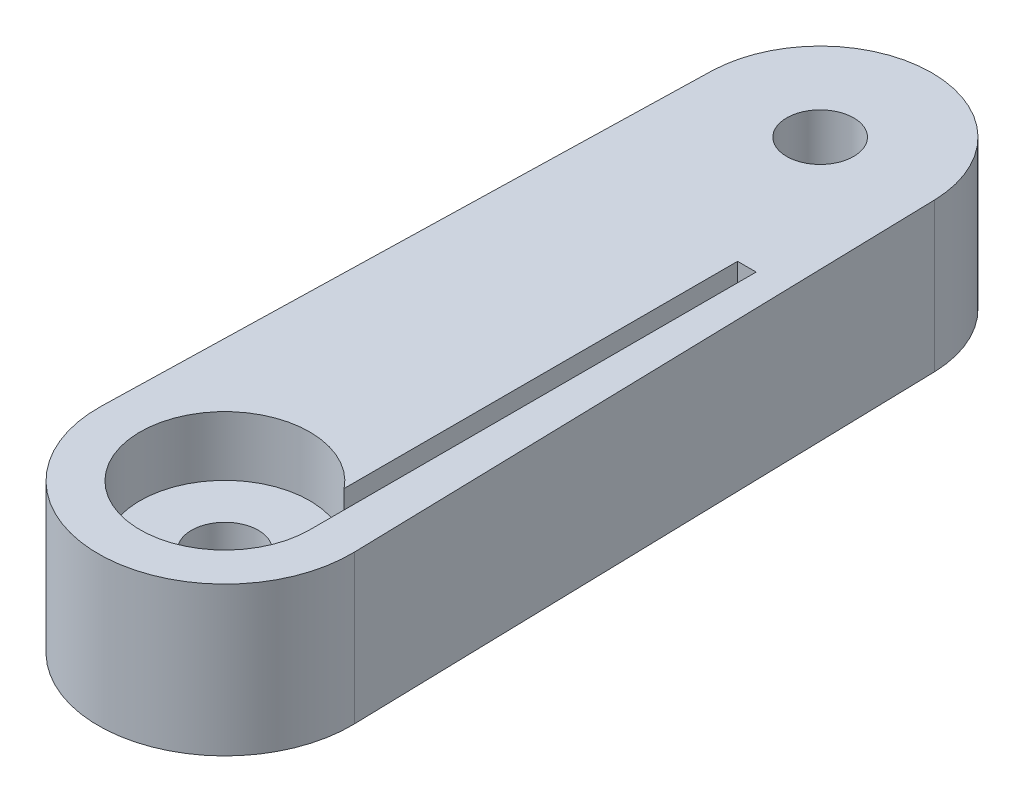
ISO-10303-21;
HEADER;
FILE_DESCRIPTION(('STEP AP214'),'2;1');
FILE_NAME('part.step','',(''),(''),'','','');
FILE_SCHEMA(('AUTOMOTIVE_DESIGN { 1 0 10303 214 1 1 1 1 }'));
ENDSEC;
DATA;
#1=APPLICATION_CONTEXT('core data for automotive mechanical design processes');
#2=APPLICATION_PROTOCOL_DEFINITION('international standard','automotive_design',2000,#1);
#3=PRODUCT_CONTEXT('',#1,'mechanical');
#4=PRODUCT('Part','Part','',(#3));
#5=PRODUCT_RELATED_PRODUCT_CATEGORY('part','',(#4));
#6=PRODUCT_DEFINITION_FORMATION('','',#4);
#7=PRODUCT_DEFINITION_CONTEXT('part definition',#1,'design');
#8=PRODUCT_DEFINITION('design','',#6,#7);
#9=PRODUCT_DEFINITION_SHAPE('','',#8);
#10=(LENGTH_UNIT() NAMED_UNIT(*) SI_UNIT(.MILLI.,.METRE.));
#11=(NAMED_UNIT(*) PLANE_ANGLE_UNIT() SI_UNIT($,.RADIAN.));
#12=(NAMED_UNIT(*) SI_UNIT($,.STERADIAN.) SOLID_ANGLE_UNIT());
#13=UNCERTAINTY_MEASURE_WITH_UNIT(LENGTH_MEASURE(1.E-05),#10,'distance_accuracy_value','');
#14=(GEOMETRIC_REPRESENTATION_CONTEXT(3) GLOBAL_UNCERTAINTY_ASSIGNED_CONTEXT((#13)) GLOBAL_UNIT_ASSIGNED_CONTEXT((#10,
#11,#12)) REPRESENTATION_CONTEXT('',''));
#15=CARTESIAN_POINT('',(0.,0.,0.));
#16=DIRECTION('',(0.,0.,1.));
#17=DIRECTION('',(1.,0.,0.));
#18=AXIS2_PLACEMENT_3D('',#15,#16,#17);
#19=CARTESIAN_POINT('',(0.,0.,0.));
#20=DIRECTION('',(0.,1.,0.));
#21=DIRECTION('',(0.,0.,1.));
#22=AXIS2_PLACEMENT_3D('',#19,#20,#21);
#23=PLANE('',#22);
#24=DIRECTION('',(0.025,0.,-0.99968745115661));
#25=VECTOR('',#24,1.);
#26=CARTESIAN_POINT('',(-4.24867166741559,0.,-0.10625));
#27=LINE('',#26,#25);
#28=CARTESIAN_POINT('',(-4.24867166741559,0.,-0.10625));
#29=VERTEX_POINT('',#28);
#30=CARTESIAN_POINT('',(-3.74882794183729,0.,-20.09375));
#31=VERTEX_POINT('',#30);
#32=EDGE_CURVE('E282',#29,#31,#27,.T.);
#33=ORIENTED_EDGE('',*,*,#32,.T.);
#34=CARTESIAN_POINT('',(0.,0.,-20.));
#35=DIRECTION('',(0.,1.,0.));
#36=DIRECTION('',(0.,0.,1.));
#37=AXIS2_PLACEMENT_3D('',#34,#35,#36);
#38=CIRCLE('',#37,3.75);
#39=CARTESIAN_POINT('',(3.74882794183729,0.,-20.09375));
#40=VERTEX_POINT('',#39);
#41=EDGE_CURVE('E293',#40,#31,#38,.T.);
#42=ORIENTED_EDGE('',*,*,#41,.F.);
#43=DIRECTION('',(-0.025,0.,-0.99968745115661));
#44=VECTOR('',#43,1.);
#45=CARTESIAN_POINT('',(4.24867166741559,0.,-0.10625));
#46=LINE('',#45,#44);
#47=CARTESIAN_POINT('',(4.24867166741559,0.,-0.10625));
#48=VERTEX_POINT('',#47);
#49=EDGE_CURVE('E307',#48,#40,#46,.T.);
#50=ORIENTED_EDGE('',*,*,#49,.F.);
#51=CARTESIAN_POINT('',(0.,0.,0.));
#52=DIRECTION('',(0.,1.,0.));
#53=DIRECTION('',(0.,0.,1.));
#54=AXIS2_PLACEMENT_3D('',#51,#52,#53);
#55=CIRCLE('',#54,4.25);
#56=EDGE_CURVE('E305',#29,#48,#55,.T.);
#57=ORIENTED_EDGE('',*,*,#56,.F.);
#58=EDGE_LOOP('',(#33,#42,#50,#57));
#59=FACE_BOUND('',#58,.T.);
#60=DIRECTION('',(-0.866025403784439,0.,0.5));
#61=VECTOR('',#60,1.);
#62=CARTESIAN_POINT('',(1.0625,0.,1.84030398304193));
#63=LINE('',#62,#61);
#64=CARTESIAN_POINT('',(2.125,0.,1.22686932202796));
#65=VERTEX_POINT('',#64);
#66=CARTESIAN_POINT('',(0.,0.,2.45373864405591));
#67=VERTEX_POINT('',#66);
#68=EDGE_CURVE('E230',#65,#67,#63,.T.);
#69=ORIENTED_EDGE('',*,*,#68,.F.);
#70=DIRECTION('',(0.,0.,1.));
#71=VECTOR('',#70,1.);
#72=CARTESIAN_POINT('',(2.125,0.,0.));
#73=LINE('',#72,#71);
#74=CARTESIAN_POINT('',(2.125,0.,-1.22686932202796));
#75=VERTEX_POINT('',#74);
#76=EDGE_CURVE('E65',#75,#65,#73,.T.);
#77=ORIENTED_EDGE('',*,*,#76,.F.);
#78=DIRECTION('',(0.866025403784439,0.,0.5));
#79=VECTOR('',#78,1.);
#80=CARTESIAN_POINT('',(1.0625,0.,-1.84030398304193));
#81=LINE('',#80,#79);
#82=CARTESIAN_POINT('',(0.,0.,-2.45373864405591));
#83=VERTEX_POINT('',#82);
#84=EDGE_CURVE('E210',#83,#75,#81,.T.);
#85=ORIENTED_EDGE('',*,*,#84,.F.);
#86=DIRECTION('',(0.866025403784439,0.,-0.5));
#87=VECTOR('',#86,1.);
#88=CARTESIAN_POINT('',(-1.0625,0.,-1.84030398304193));
#89=LINE('',#88,#87);
#90=CARTESIAN_POINT('',(-2.125,0.,-1.22686932202796));
#91=VERTEX_POINT('',#90);
#92=EDGE_CURVE('E239',#91,#83,#89,.T.);
#93=ORIENTED_EDGE('',*,*,#92,.F.);
#94=DIRECTION('',(0.,0.,-1.));
#95=VECTOR('',#94,1.);
#96=CARTESIAN_POINT('',(-2.125,0.,0.));
#97=LINE('',#96,#95);
#98=CARTESIAN_POINT('',(-2.125,0.,1.22686932202796));
#99=VERTEX_POINT('',#98);
#100=EDGE_CURVE('E236',#99,#91,#97,.T.);
#101=ORIENTED_EDGE('',*,*,#100,.F.);
#102=DIRECTION('',(-0.866025403784439,0.,-0.5));
#103=VECTOR('',#102,1.);
#104=CARTESIAN_POINT('',(-1.0625,0.,1.84030398304193));
#105=LINE('',#104,#103);
#106=EDGE_CURVE('E233',#67,#99,#105,.T.);
#107=ORIENTED_EDGE('',*,*,#106,.F.);
#108=EDGE_LOOP('',(#69,#77,#85,#93,#101,#107));
#109=FACE_BOUND('',#108,.T.);
#110=DIRECTION('',(0.,0.,1.));
#111=VECTOR('',#110,1.);
#112=CARTESIAN_POINT('',(-2.125,0.,-21.226869322028));
#113=LINE('',#112,#111);
#114=CARTESIAN_POINT('',(-2.125,0.,-21.226869322028));
#115=VERTEX_POINT('',#114);
#116=CARTESIAN_POINT('',(-2.125,0.,-18.773130677972));
#117=VERTEX_POINT('',#116);
#118=EDGE_CURVE('E57',#115,#117,#113,.T.);
#119=ORIENTED_EDGE('',*,*,#118,.T.);
#120=DIRECTION('',(0.866025403784439,0.,0.5));
#121=VECTOR('',#120,1.);
#122=CARTESIAN_POINT('',(-2.125,0.,-18.773130677972));
#123=LINE('',#122,#121);
#124=CARTESIAN_POINT('',(0.,0.,-17.5462613559441));
#125=VERTEX_POINT('',#124);
#126=EDGE_CURVE('E198',#117,#125,#123,.T.);
#127=ORIENTED_EDGE('',*,*,#126,.T.);
#128=DIRECTION('',(0.866025403784439,0.,-0.5));
#129=VECTOR('',#128,1.);
#130=CARTESIAN_POINT('',(0.,0.,-17.5462613559441));
#131=LINE('',#130,#129);
#132=CARTESIAN_POINT('',(2.125,0.,-18.773130677972));
#133=VERTEX_POINT('',#132);
#134=EDGE_CURVE('E629',#125,#133,#131,.T.);
#135=ORIENTED_EDGE('',*,*,#134,.T.);
#136=DIRECTION('',(0.,0.,-1.));
#137=VECTOR('',#136,1.);
#138=CARTESIAN_POINT('',(2.125,0.,-18.773130677972));
#139=LINE('',#138,#137);
#140=CARTESIAN_POINT('',(2.125,0.,-21.226869322028));
#141=VERTEX_POINT('',#140);
#142=EDGE_CURVE('E626',#133,#141,#139,.T.);
#143=ORIENTED_EDGE('',*,*,#142,.T.);
#144=DIRECTION('',(-0.866025403784438,0.,-0.500000000000001));
#145=VECTOR('',#144,1.);
#146=CARTESIAN_POINT('',(2.125,0.,-21.226869322028));
#147=LINE('',#146,#145);
#148=CARTESIAN_POINT('',(0.,0.,-22.4537386440559));
#149=VERTEX_POINT('',#148);
#150=EDGE_CURVE('E620',#141,#149,#147,.T.);
#151=ORIENTED_EDGE('',*,*,#150,.T.);
#152=DIRECTION('',(-0.866025403784439,0.,0.5));
#153=VECTOR('',#152,1.);
#154=CARTESIAN_POINT('',(0.,0.,-22.4537386440559));
#155=LINE('',#154,#153);
#156=EDGE_CURVE('E194',#149,#115,#155,.T.);
#157=ORIENTED_EDGE('',*,*,#156,.T.);
#158=EDGE_LOOP('',(#119,#127,#135,#143,#151,#157));
#159=FACE_BOUND('',#158,.T.);
#160=ADVANCED_FACE('F41',(#59,#109,#159),#23,.F.);
#161=CARTESIAN_POINT('',(0.,5.,0.));
#162=DIRECTION('',(0.,-1.,0.));
#163=DIRECTION('',(0.,0.,-1.));
#164=AXIS2_PLACEMENT_3D('',#161,#162,#163);
#165=CYLINDRICAL_SURFACE('',#164,1.125);
#166=CARTESIAN_POINT('',(0.,3.,0.));
#167=DIRECTION('',(0.,1.,0.));
#168=DIRECTION('',(0.,0.,1.));
#169=AXIS2_PLACEMENT_3D('',#166,#167,#168);
#170=CIRCLE('',#169,1.125);
#171=CARTESIAN_POINT('',(0.,3.,1.125));
#172=VERTEX_POINT('',#171);
#173=EDGE_CURVE('E267',#172,#172,#170,.F.);
#174=ORIENTED_EDGE('',*,*,#173,.F.);
#175=EDGE_LOOP('',(#174));
#176=FACE_BOUND('',#175,.T.);
#177=CARTESIAN_POINT('',(0.,1.5,0.));
#178=DIRECTION('',(0.,-1.,0.));
#179=DIRECTION('',(0.,0.,-1.));
#180=AXIS2_PLACEMENT_3D('',#177,#178,#179);
#181=CIRCLE('',#180,1.125);
#182=CARTESIAN_POINT('',(0.,1.5,-1.125));
#183=VERTEX_POINT('',#182);
#184=EDGE_CURVE('E206',#183,#183,#181,.F.);
#185=ORIENTED_EDGE('',*,*,#184,.F.);
#186=EDGE_LOOP('',(#185));
#187=FACE_BOUND('',#186,.T.);
#188=ADVANCED_FACE('F340',(#176,#187),#165,.F.);
#189=CARTESIAN_POINT('',(-4.24867166741559,5.,-0.10625));
#190=DIRECTION('',(-0.99968745115661,0.,-0.025));
#191=DIRECTION('',(-0.025,0.,0.99968745115661));
#192=AXIS2_PLACEMENT_3D('',#189,#190,#191);
#193=PLANE('',#192);
#194=ORIENTED_EDGE('',*,*,#32,.F.);
#195=DIRECTION('',(0.,-1.,0.));
#196=VECTOR('',#195,1.);
#197=CARTESIAN_POINT('',(-4.24867166741559,5.,-0.10625));
#198=LINE('',#197,#196);
#199=CARTESIAN_POINT('',(-4.24867166741559,5.,-0.10625));
#200=VERTEX_POINT('',#199);
#201=EDGE_CURVE('E11',#200,#29,#198,.T.);
#202=ORIENTED_EDGE('',*,*,#201,.F.);
#203=DIRECTION('',(0.025,0.,-0.99968745115661));
#204=VECTOR('',#203,1.);
#205=CARTESIAN_POINT('',(-4.24867166741559,5.,-0.10625));
#206=LINE('',#205,#204);
#207=CARTESIAN_POINT('',(-3.74882794183729,5.,-20.09375));
#208=VERTEX_POINT('',#207);
#209=EDGE_CURVE('E289',#200,#208,#206,.T.);
#210=ORIENTED_EDGE('',*,*,#209,.T.);
#211=DIRECTION('',(0.,-1.,0.));
#212=VECTOR('',#211,1.);
#213=CARTESIAN_POINT('',(-3.74882794183729,5.,-20.09375));
#214=LINE('',#213,#212);
#215=EDGE_CURVE('E302',#208,#31,#214,.T.);
#216=ORIENTED_EDGE('',*,*,#215,.T.);
#217=EDGE_LOOP('',(#194,#202,#210,#216));
#218=FACE_BOUND('',#217,.T.);
#219=ADVANCED_FACE('F43',(#218),#193,.T.);
#220=CARTESIAN_POINT('',(0.,5.,0.));
#221=DIRECTION('',(0.,-1.,0.));
#222=DIRECTION('',(0.,0.,-1.));
#223=AXIS2_PLACEMENT_3D('',#220,#221,#222);
#224=CYLINDRICAL_SURFACE('',#223,4.25);
#225=ORIENTED_EDGE('',*,*,#56,.T.);
#226=DIRECTION('',(0.,-1.,0.));
#227=VECTOR('',#226,1.);
#228=CARTESIAN_POINT('',(4.24867166741559,5.,-0.10625));
#229=LINE('',#228,#227);
#230=CARTESIAN_POINT('',(4.24867166741559,5.,-0.10625));
#231=VERTEX_POINT('',#230);
#232=EDGE_CURVE('E50',#231,#48,#229,.T.);
#233=ORIENTED_EDGE('',*,*,#232,.F.);
#234=CARTESIAN_POINT('',(0.,5.,0.));
#235=DIRECTION('',(0.,1.,0.));
#236=DIRECTION('',(0.,0.,1.));
#237=AXIS2_PLACEMENT_3D('',#234,#235,#236);
#238=CIRCLE('',#237,4.25);
#239=EDGE_CURVE('E292',#200,#231,#238,.T.);
#240=ORIENTED_EDGE('',*,*,#239,.F.);
#241=ORIENTED_EDGE('',*,*,#201,.T.);
#242=EDGE_LOOP('',(#225,#233,#240,#241));
#243=FACE_BOUND('',#242,.T.);
#244=ADVANCED_FACE('F337',(#243),#224,.T.);
#245=CARTESIAN_POINT('',(4.24867166741559,5.,-0.10625));
#246=DIRECTION('',(-0.99968745115661,0.,0.025));
#247=DIRECTION('',(0.025,0.,0.99968745115661));
#248=AXIS2_PLACEMENT_3D('',#245,#246,#247);
#249=PLANE('',#248);
#250=ORIENTED_EDGE('',*,*,#49,.T.);
#251=DIRECTION('',(0.,-1.,0.));
#252=VECTOR('',#251,1.);
#253=CARTESIAN_POINT('',(3.74882794183729,5.,-20.09375));
#254=LINE('',#253,#252);
#255=CARTESIAN_POINT('',(3.74882794183729,5.,-20.09375));
#256=VERTEX_POINT('',#255);
#257=EDGE_CURVE('E312',#256,#40,#254,.T.);
#258=ORIENTED_EDGE('',*,*,#257,.F.);
#259=DIRECTION('',(-0.025,0.,-0.99968745115661));
#260=VECTOR('',#259,1.);
#261=CARTESIAN_POINT('',(4.24867166741559,5.,-0.10625));
#262=LINE('',#261,#260);
#263=EDGE_CURVE('E295',#231,#256,#262,.T.);
#264=ORIENTED_EDGE('',*,*,#263,.F.);
#265=ORIENTED_EDGE('',*,*,#232,.T.);
#266=EDGE_LOOP('',(#250,#258,#264,#265));
#267=FACE_BOUND('',#266,.T.);
#268=ADVANCED_FACE('F320',(#267),#249,.F.);
#269=CARTESIAN_POINT('',(0.,5.,-20.));
#270=DIRECTION('',(0.,-1.,0.));
#271=DIRECTION('',(0.,0.,-1.));
#272=AXIS2_PLACEMENT_3D('',#269,#270,#271);
#273=CYLINDRICAL_SURFACE('',#272,1.125);
#274=CARTESIAN_POINT('',(0.,2.,-20.));
#275=DIRECTION('',(0.,1.,0.));
#276=DIRECTION('',(0.,0.,1.));
#277=AXIS2_PLACEMENT_3D('',#274,#275,#276);
#278=CIRCLE('',#277,1.125);
#279=CARTESIAN_POINT('',(0.,2.,-18.875));
#280=VERTEX_POINT('',#279);
#281=EDGE_CURVE('E45',#280,#280,#278,.T.);
#282=ORIENTED_EDGE('',*,*,#281,.F.);
#283=EDGE_LOOP('',(#282));
#284=FACE_BOUND('',#283,.T.);
#285=CARTESIAN_POINT('',(0.,5.,-20.));
#286=DIRECTION('',(0.,1.,0.));
#287=DIRECTION('',(0.,0.,1.));
#288=AXIS2_PLACEMENT_3D('',#285,#286,#287);
#289=CIRCLE('',#288,1.125);
#290=CARTESIAN_POINT('',(0.,5.,-18.875));
#291=VERTEX_POINT('',#290);
#292=EDGE_CURVE('E299',#291,#291,#289,.T.);
#293=ORIENTED_EDGE('',*,*,#292,.T.);
#294=EDGE_LOOP('',(#293));
#295=FACE_BOUND('',#294,.T.);
#296=ADVANCED_FACE('F354',(#284,#295),#273,.F.);
#297=CARTESIAN_POINT('',(0.,5.,-20.));
#298=DIRECTION('',(0.,-1.,0.));
#299=DIRECTION('',(0.,0.,-1.));
#300=AXIS2_PLACEMENT_3D('',#297,#298,#299);
#301=CYLINDRICAL_SURFACE('',#300,3.75);
#302=ORIENTED_EDGE('',*,*,#41,.T.);
#303=ORIENTED_EDGE('',*,*,#215,.F.);
#304=CARTESIAN_POINT('',(0.,5.,-20.));
#305=DIRECTION('',(0.,1.,0.));
#306=DIRECTION('',(0.,0.,1.));
#307=AXIS2_PLACEMENT_3D('',#304,#305,#306);
#308=CIRCLE('',#307,3.75);
#309=EDGE_CURVE('E297',#256,#208,#308,.T.);
#310=ORIENTED_EDGE('',*,*,#309,.F.);
#311=ORIENTED_EDGE('',*,*,#257,.T.);
#312=EDGE_LOOP('',(#302,#303,#310,#311));
#313=FACE_BOUND('',#312,.T.);
#314=ADVANCED_FACE('F331',(#313),#301,.T.);
#315=CARTESIAN_POINT('',(0.,5.,0.));
#316=DIRECTION('',(0.,1.,0.));
#317=DIRECTION('',(0.,0.,1.));
#318=AXIS2_PLACEMENT_3D('',#315,#316,#317);
#319=PLANE('',#318);
#320=CARTESIAN_POINT('',(0.,5.,0.));
#321=DIRECTION('',(0.,1.,0.));
#322=DIRECTION('',(0.,0.,1.));
#323=AXIS2_PLACEMENT_3D('',#320,#321,#322);
#324=CIRCLE('',#323,2.85);
#325=CARTESIAN_POINT('',(2.225,5.,-1.78097585609688));
#326=VERTEX_POINT('',#325);
#327=CARTESIAN_POINT('',(2.85,5.,0.));
#328=VERTEX_POINT('',#327);
#329=EDGE_CURVE('E246',#326,#328,#324,.T.);
#330=ORIENTED_EDGE('',*,*,#329,.F.);
#331=DIRECTION('',(0.,0.,-1.));
#332=VECTOR('',#331,1.);
#333=CARTESIAN_POINT('',(2.225,5.,0.));
#334=LINE('',#333,#332);
#335=CARTESIAN_POINT('',(2.225,5.,-15.));
#336=VERTEX_POINT('',#335);
#337=EDGE_CURVE('E260',#326,#336,#334,.T.);
#338=ORIENTED_EDGE('',*,*,#337,.T.);
#339=DIRECTION('',(1.,0.,0.));
#340=VECTOR('',#339,1.);
#341=CARTESIAN_POINT('',(0.,5.,-15.));
#342=LINE('',#341,#340);
#343=CARTESIAN_POINT('',(2.85,5.,-15.));
#344=VERTEX_POINT('',#343);
#345=EDGE_CURVE('E275',#336,#344,#342,.T.);
#346=ORIENTED_EDGE('',*,*,#345,.T.);
#347=DIRECTION('',(0.,0.,-1.));
#348=VECTOR('',#347,1.);
#349=CARTESIAN_POINT('',(2.85,5.,0.));
#350=LINE('',#349,#348);
#351=EDGE_CURVE('E272',#328,#344,#350,.T.);
#352=ORIENTED_EDGE('',*,*,#351,.F.);
#353=EDGE_LOOP('',(#330,#338,#346,#352));
#354=FACE_BOUND('',#353,.T.);
#355=ORIENTED_EDGE('',*,*,#209,.F.);
#356=ORIENTED_EDGE('',*,*,#239,.T.);
#357=ORIENTED_EDGE('',*,*,#263,.T.);
#358=ORIENTED_EDGE('',*,*,#309,.T.);
#359=EDGE_LOOP('',(#355,#356,#357,#358));
#360=FACE_BOUND('',#359,.T.);
#361=ORIENTED_EDGE('',*,*,#292,.F.);
#362=EDGE_LOOP('',(#361));
#363=FACE_BOUND('',#362,.T.);
#364=ADVANCED_FACE('F335',(#354,#360,#363),#319,.T.);
#365=CARTESIAN_POINT('',(0.,3.,0.));
#366=DIRECTION('',(0.,1.,0.));
#367=DIRECTION('',(0.,0.,1.));
#368=AXIS2_PLACEMENT_3D('',#365,#366,#367);
#369=CYLINDRICAL_SURFACE('',#368,2.85);
#370=ORIENTED_EDGE('',*,*,#329,.T.);
#371=DIRECTION('',(0.,1.,0.));
#372=VECTOR('',#371,1.);
#373=CARTESIAN_POINT('',(2.85,3.,0.));
#374=LINE('',#373,#372);
#375=CARTESIAN_POINT('',(2.85,3.,0.));
#376=VERTEX_POINT('',#375);
#377=EDGE_CURVE('E270',#376,#328,#374,.T.);
#378=ORIENTED_EDGE('',*,*,#377,.F.);
#379=CARTESIAN_POINT('',(0.,3.,0.));
#380=DIRECTION('',(0.,1.,0.));
#381=DIRECTION('',(0.,0.,1.));
#382=AXIS2_PLACEMENT_3D('',#379,#380,#381);
#383=CIRCLE('',#382,2.85);
#384=CARTESIAN_POINT('',(2.225,3.,-1.78097585609688));
#385=VERTEX_POINT('',#384);
#386=EDGE_CURVE('E256',#385,#376,#383,.T.);
#387=ORIENTED_EDGE('',*,*,#386,.F.);
#388=DIRECTION('',(0.,1.,0.));
#389=VECTOR('',#388,1.);
#390=CARTESIAN_POINT('',(2.225,3.,-1.78097585609688));
#391=LINE('',#390,#389);
#392=EDGE_CURVE('E280',#385,#326,#391,.T.);
#393=ORIENTED_EDGE('',*,*,#392,.T.);
#394=EDGE_LOOP('',(#370,#378,#387,#393));
#395=FACE_BOUND('',#394,.T.);
#396=ADVANCED_FACE('F380',(#395),#369,.F.);
#397=CARTESIAN_POINT('',(2.225,3.,0.));
#398=DIRECTION('',(1.,0.,0.));
#399=DIRECTION('',(0.,0.,-1.));
#400=AXIS2_PLACEMENT_3D('',#397,#398,#399);
#401=PLANE('',#400);
#402=ORIENTED_EDGE('',*,*,#337,.F.);
#403=ORIENTED_EDGE('',*,*,#392,.F.);
#404=DIRECTION('',(0.,0.,-1.));
#405=VECTOR('',#404,1.);
#406=CARTESIAN_POINT('',(2.225,3.,0.));
#407=LINE('',#406,#405);
#408=CARTESIAN_POINT('',(2.225,3.,-15.));
#409=VERTEX_POINT('',#408);
#410=EDGE_CURVE('E265',#385,#409,#407,.T.);
#411=ORIENTED_EDGE('',*,*,#410,.T.);
#412=DIRECTION('',(0.,1.,0.));
#413=VECTOR('',#412,1.);
#414=CARTESIAN_POINT('',(2.225,3.,-15.));
#415=LINE('',#414,#413);
#416=EDGE_CURVE('E283',#409,#336,#415,.T.);
#417=ORIENTED_EDGE('',*,*,#416,.T.);
#418=EDGE_LOOP('',(#402,#403,#411,#417));
#419=FACE_BOUND('',#418,.T.);
#420=ADVANCED_FACE('F387',(#419),#401,.T.);
#421=CARTESIAN_POINT('',(0.,3.,-15.));
#422=DIRECTION('',(0.,0.,1.));
#423=DIRECTION('',(1.,0.,0.));
#424=AXIS2_PLACEMENT_3D('',#421,#422,#423);
#425=PLANE('',#424);
#426=ORIENTED_EDGE('',*,*,#345,.F.);
#427=ORIENTED_EDGE('',*,*,#416,.F.);
#428=DIRECTION('',(1.,0.,0.));
#429=VECTOR('',#428,1.);
#430=CARTESIAN_POINT('',(0.,3.,-15.));
#431=LINE('',#430,#429);
#432=CARTESIAN_POINT('',(2.85,3.,-15.));
#433=VERTEX_POINT('',#432);
#434=EDGE_CURVE('E263',#409,#433,#431,.T.);
#435=ORIENTED_EDGE('',*,*,#434,.T.);
#436=DIRECTION('',(0.,1.,0.));
#437=VECTOR('',#436,1.);
#438=CARTESIAN_POINT('',(2.85,3.,-15.));
#439=LINE('',#438,#437);
#440=EDGE_CURVE('E285',#433,#344,#439,.T.);
#441=ORIENTED_EDGE('',*,*,#440,.T.);
#442=EDGE_LOOP('',(#426,#427,#435,#441));
#443=FACE_BOUND('',#442,.T.);
#444=ADVANCED_FACE('F394',(#443),#425,.T.);
#445=CARTESIAN_POINT('',(2.85,3.,0.));
#446=DIRECTION('',(1.,0.,0.));
#447=DIRECTION('',(0.,0.,-1.));
#448=AXIS2_PLACEMENT_3D('',#445,#446,#447);
#449=PLANE('',#448);
#450=ORIENTED_EDGE('',*,*,#351,.T.);
#451=ORIENTED_EDGE('',*,*,#440,.F.);
#452=DIRECTION('',(0.,0.,-1.));
#453=VECTOR('',#452,1.);
#454=CARTESIAN_POINT('',(2.85,3.,0.));
#455=LINE('',#454,#453);
#456=EDGE_CURVE('E259',#376,#433,#455,.T.);
#457=ORIENTED_EDGE('',*,*,#456,.F.);
#458=ORIENTED_EDGE('',*,*,#377,.T.);
#459=EDGE_LOOP('',(#450,#451,#457,#458));
#460=FACE_BOUND('',#459,.T.);
#461=ADVANCED_FACE('F402',(#460),#449,.F.);
#462=CARTESIAN_POINT('',(0.,3.,0.));
#463=DIRECTION('',(0.,1.,0.));
#464=DIRECTION('',(0.,0.,1.));
#465=AXIS2_PLACEMENT_3D('',#462,#463,#464);
#466=PLANE('',#465);
#467=ORIENTED_EDGE('',*,*,#386,.T.);
#468=ORIENTED_EDGE('',*,*,#456,.T.);
#469=ORIENTED_EDGE('',*,*,#434,.F.);
#470=ORIENTED_EDGE('',*,*,#410,.F.);
#471=EDGE_LOOP('',(#467,#468,#469,#470));
#472=FACE_BOUND('',#471,.T.);
#473=ORIENTED_EDGE('',*,*,#173,.T.);
#474=EDGE_LOOP('',(#473));
#475=FACE_BOUND('',#474,.T.);
#476=ADVANCED_FACE('F410',(#472,#475),#466,.T.);
#477=CARTESIAN_POINT('',(2.125,1.5,0.));
#478=DIRECTION('',(1.,0.,0.));
#479=DIRECTION('',(0.,0.,-1.));
#480=AXIS2_PLACEMENT_3D('',#477,#478,#479);
#481=PLANE('',#480);
#482=ORIENTED_EDGE('',*,*,#76,.T.);
#483=DIRECTION('',(0.,-1.,0.));
#484=VECTOR('',#483,1.);
#485=CARTESIAN_POINT('',(2.125,1.5,1.22686932202796));
#486=LINE('',#485,#484);
#487=CARTESIAN_POINT('',(2.125,1.5,1.22686932202796));
#488=VERTEX_POINT('',#487);
#489=EDGE_CURVE('E228',#488,#65,#486,.T.);
#490=ORIENTED_EDGE('',*,*,#489,.F.);
#491=DIRECTION('',(0.,0.,1.));
#492=VECTOR('',#491,1.);
#493=CARTESIAN_POINT('',(2.125,1.5,0.));
#494=LINE('',#493,#492);
#495=CARTESIAN_POINT('',(2.125,1.5,-1.22686932202796));
#496=VERTEX_POINT('',#495);
#497=EDGE_CURVE('E209',#496,#488,#494,.T.);
#498=ORIENTED_EDGE('',*,*,#497,.F.);
#499=DIRECTION('',(0.,-1.,0.));
#500=VECTOR('',#499,1.);
#501=CARTESIAN_POINT('',(2.125,1.5,-1.22686932202796));
#502=LINE('',#501,#500);
#503=EDGE_CURVE('E244',#496,#75,#502,.T.);
#504=ORIENTED_EDGE('',*,*,#503,.T.);
#505=EDGE_LOOP('',(#482,#490,#498,#504));
#506=FACE_BOUND('',#505,.T.);
#507=ADVANCED_FACE('F418',(#506),#481,.F.);
#508=CARTESIAN_POINT('',(1.0625,1.5,-1.84030398304193));
#509=DIRECTION('',(0.5,0.,-0.866025403784439));
#510=DIRECTION('',(-0.866025403784439,0.,-0.5));
#511=AXIS2_PLACEMENT_3D('',#508,#509,#510);
#512=PLANE('',#511);
#513=ORIENTED_EDGE('',*,*,#84,.T.);
#514=ORIENTED_EDGE('',*,*,#503,.F.);
#515=DIRECTION('',(0.866025403784439,0.,0.5));
#516=VECTOR('',#515,1.);
#517=CARTESIAN_POINT('',(1.0625,1.5,-1.84030398304193));
#518=LINE('',#517,#516);
#519=CARTESIAN_POINT('',(0.,1.5,-2.45373864405591));
#520=VERTEX_POINT('',#519);
#521=EDGE_CURVE('E225',#520,#496,#518,.T.);
#522=ORIENTED_EDGE('',*,*,#521,.F.);
#523=DIRECTION('',(0.,-1.,0.));
#524=VECTOR('',#523,1.);
#525=CARTESIAN_POINT('',(0.,1.5,-2.45373864405591));
#526=LINE('',#525,#524);
#527=EDGE_CURVE('E247',#520,#83,#526,.T.);
#528=ORIENTED_EDGE('',*,*,#527,.T.);
#529=EDGE_LOOP('',(#513,#514,#522,#528));
#530=FACE_BOUND('',#529,.T.);
#531=ADVANCED_FACE('F427',(#530),#512,.F.);
#532=CARTESIAN_POINT('',(-1.0625,1.5,-1.84030398304193));
#533=DIRECTION('',(-0.5,0.,-0.866025403784438));
#534=DIRECTION('',(-0.866025403784439,0.,0.5));
#535=AXIS2_PLACEMENT_3D('',#532,#533,#534);
#536=PLANE('',#535);
#537=ORIENTED_EDGE('',*,*,#92,.T.);
#538=ORIENTED_EDGE('',*,*,#527,.F.);
#539=DIRECTION('',(0.866025403784439,0.,-0.5));
#540=VECTOR('',#539,1.);
#541=CARTESIAN_POINT('',(-1.0625,1.5,-1.84030398304193));
#542=LINE('',#541,#540);
#543=CARTESIAN_POINT('',(-2.125,1.5,-1.22686932202796));
#544=VERTEX_POINT('',#543);
#545=EDGE_CURVE('E222',#544,#520,#542,.T.);
#546=ORIENTED_EDGE('',*,*,#545,.F.);
#547=DIRECTION('',(0.,-1.,0.));
#548=VECTOR('',#547,1.);
#549=CARTESIAN_POINT('',(-2.125,1.5,-1.22686932202796));
#550=LINE('',#549,#548);
#551=EDGE_CURVE('E249',#544,#91,#550,.T.);
#552=ORIENTED_EDGE('',*,*,#551,.T.);
#553=EDGE_LOOP('',(#537,#538,#546,#552));
#554=FACE_BOUND('',#553,.T.);
#555=ADVANCED_FACE('F434',(#554),#536,.F.);
#556=CARTESIAN_POINT('',(-2.125,1.5,0.));
#557=DIRECTION('',(-1.,0.,0.));
#558=DIRECTION('',(0.,0.,1.));
#559=AXIS2_PLACEMENT_3D('',#556,#557,#558);
#560=PLANE('',#559);
#561=ORIENTED_EDGE('',*,*,#100,.T.);
#562=ORIENTED_EDGE('',*,*,#551,.F.);
#563=DIRECTION('',(0.,0.,-1.));
#564=VECTOR('',#563,1.);
#565=CARTESIAN_POINT('',(-2.125,1.5,0.));
#566=LINE('',#565,#564);
#567=CARTESIAN_POINT('',(-2.125,1.5,1.22686932202796));
#568=VERTEX_POINT('',#567);
#569=EDGE_CURVE('E219',#568,#544,#566,.T.);
#570=ORIENTED_EDGE('',*,*,#569,.F.);
#571=DIRECTION('',(0.,-1.,0.));
#572=VECTOR('',#571,1.);
#573=CARTESIAN_POINT('',(-2.125,1.5,1.22686932202796));
#574=LINE('',#573,#572);
#575=EDGE_CURVE('E251',#568,#99,#574,.T.);
#576=ORIENTED_EDGE('',*,*,#575,.T.);
#577=EDGE_LOOP('',(#561,#562,#570,#576));
#578=FACE_BOUND('',#577,.T.);
#579=ADVANCED_FACE('F442',(#578),#560,.F.);
#580=CARTESIAN_POINT('',(-1.0625,1.5,1.84030398304193));
#581=DIRECTION('',(-0.5,0.,0.866025403784439));
#582=DIRECTION('',(0.866025403784439,0.,0.5));
#583=AXIS2_PLACEMENT_3D('',#580,#581,#582);
#584=PLANE('',#583);
#585=ORIENTED_EDGE('',*,*,#106,.T.);
#586=ORIENTED_EDGE('',*,*,#575,.F.);
#587=DIRECTION('',(-0.866025403784439,0.,-0.5));
#588=VECTOR('',#587,1.);
#589=CARTESIAN_POINT('',(-1.0625,1.5,1.84030398304193));
#590=LINE('',#589,#588);
#591=CARTESIAN_POINT('',(0.,1.5,2.45373864405591));
#592=VERTEX_POINT('',#591);
#593=EDGE_CURVE('E216',#592,#568,#590,.T.);
#594=ORIENTED_EDGE('',*,*,#593,.F.);
#595=DIRECTION('',(0.,-1.,0.));
#596=VECTOR('',#595,1.);
#597=CARTESIAN_POINT('',(0.,1.5,2.45373864405591));
#598=LINE('',#597,#596);
#599=EDGE_CURVE('E253',#592,#67,#598,.T.);
#600=ORIENTED_EDGE('',*,*,#599,.T.);
#601=EDGE_LOOP('',(#585,#586,#594,#600));
#602=FACE_BOUND('',#601,.T.);
#603=ADVANCED_FACE('F450',(#602),#584,.F.);
#604=CARTESIAN_POINT('',(1.0625,1.5,1.84030398304193));
#605=DIRECTION('',(0.5,0.,0.866025403784439));
#606=DIRECTION('',(0.866025403784439,0.,-0.5));
#607=AXIS2_PLACEMENT_3D('',#604,#605,#606);
#608=PLANE('',#607);
#609=ORIENTED_EDGE('',*,*,#68,.T.);
#610=ORIENTED_EDGE('',*,*,#599,.F.);
#611=DIRECTION('',(-0.866025403784439,0.,0.5));
#612=VECTOR('',#611,1.);
#613=CARTESIAN_POINT('',(1.0625,1.5,1.84030398304193));
#614=LINE('',#613,#612);
#615=EDGE_CURVE('E213',#488,#592,#614,.T.);
#616=ORIENTED_EDGE('',*,*,#615,.F.);
#617=ORIENTED_EDGE('',*,*,#489,.T.);
#618=EDGE_LOOP('',(#609,#610,#616,#617));
#619=FACE_BOUND('',#618,.T.);
#620=ADVANCED_FACE('F458',(#619),#608,.F.);
#621=CARTESIAN_POINT('',(0.,1.5,0.));
#622=DIRECTION('',(0.,-1.,0.));
#623=DIRECTION('',(0.,0.,-1.));
#624=AXIS2_PLACEMENT_3D('',#621,#622,#623);
#625=PLANE('',#624);
#626=ORIENTED_EDGE('',*,*,#184,.T.);
#627=EDGE_LOOP('',(#626));
#628=FACE_BOUND('',#627,.T.);
#629=ORIENTED_EDGE('',*,*,#497,.T.);
#630=ORIENTED_EDGE('',*,*,#615,.T.);
#631=ORIENTED_EDGE('',*,*,#593,.T.);
#632=ORIENTED_EDGE('',*,*,#569,.T.);
#633=ORIENTED_EDGE('',*,*,#545,.T.);
#634=ORIENTED_EDGE('',*,*,#521,.T.);
#635=EDGE_LOOP('',(#629,#630,#631,#632,#633,#634));
#636=FACE_BOUND('',#635,.T.);
#637=ADVANCED_FACE('F466',(#628,#636),#625,.T.);
#638=CARTESIAN_POINT('',(-2.125,2.,-21.226869322028));
#639=DIRECTION('',(1.,0.,0.));
#640=DIRECTION('',(0.,0.,-1.));
#641=AXIS2_PLACEMENT_3D('',#638,#639,#640);
#642=PLANE('',#641);
#643=ORIENTED_EDGE('',*,*,#118,.F.);
#644=DIRECTION('',(0.,-1.,0.));
#645=VECTOR('',#644,1.);
#646=CARTESIAN_POINT('',(-2.125,2.,-21.226869322028));
#647=LINE('',#646,#645);
#648=CARTESIAN_POINT('',(-2.125,2.,-21.226869322028));
#649=VERTEX_POINT('',#648);
#650=EDGE_CURVE('E193',#649,#115,#647,.T.);
#651=ORIENTED_EDGE('',*,*,#650,.F.);
#652=DIRECTION('',(0.,0.,1.));
#653=VECTOR('',#652,1.);
#654=CARTESIAN_POINT('',(-2.125,2.,-21.226869322028));
#655=LINE('',#654,#653);
#656=CARTESIAN_POINT('',(-2.125,2.,-18.773130677972));
#657=VERTEX_POINT('',#656);
#658=EDGE_CURVE('E184',#649,#657,#655,.T.);
#659=ORIENTED_EDGE('',*,*,#658,.T.);
#660=DIRECTION('',(0.,-1.,0.));
#661=VECTOR('',#660,1.);
#662=CARTESIAN_POINT('',(-2.125,2.,-18.773130677972));
#663=LINE('',#662,#661);
#664=EDGE_CURVE('E192',#657,#117,#663,.T.);
#665=ORIENTED_EDGE('',*,*,#664,.T.);
#666=EDGE_LOOP('',(#643,#651,#659,#665));
#667=FACE_BOUND('',#666,.T.);
#668=ADVANCED_FACE('F191',(#667),#642,.T.);
#669=CARTESIAN_POINT('',(-2.125,2.,-18.773130677972));
#670=DIRECTION('',(0.5,0.,-0.866025403784439));
#671=DIRECTION('',(-0.866025403784439,0.,-0.5));
#672=AXIS2_PLACEMENT_3D('',#669,#670,#671);
#673=PLANE('',#672);
#674=ORIENTED_EDGE('',*,*,#126,.F.);
#675=ORIENTED_EDGE('',*,*,#664,.F.);
#676=DIRECTION('',(0.866025403784439,0.,0.5));
#677=VECTOR('',#676,1.);
#678=CARTESIAN_POINT('',(-2.125,2.,-18.773130677972));
#679=LINE('',#678,#677);
#680=CARTESIAN_POINT('',(0.,2.,-17.5462613559441));
#681=VERTEX_POINT('',#680);
#682=EDGE_CURVE('E180',#657,#681,#679,.T.);
#683=ORIENTED_EDGE('',*,*,#682,.T.);
#684=DIRECTION('',(0.,-1.,0.));
#685=VECTOR('',#684,1.);
#686=CARTESIAN_POINT('',(0.,2.,-17.5462613559441));
#687=LINE('',#686,#685);
#688=EDGE_CURVE('E199',#681,#125,#687,.T.);
#689=ORIENTED_EDGE('',*,*,#688,.T.);
#690=EDGE_LOOP('',(#674,#675,#683,#689));
#691=FACE_BOUND('',#690,.T.);
#692=ADVANCED_FACE('F196',(#691),#673,.T.);
#693=CARTESIAN_POINT('',(0.,2.,-17.5462613559441));
#694=DIRECTION('',(-0.5,0.,-0.866025403784439));
#695=DIRECTION('',(-0.866025403784439,0.,0.5));
#696=AXIS2_PLACEMENT_3D('',#693,#694,#695);
#697=PLANE('',#696);
#698=ORIENTED_EDGE('',*,*,#134,.F.);
#699=ORIENTED_EDGE('',*,*,#688,.F.);
#700=DIRECTION('',(0.866025403784439,0.,-0.5));
#701=VECTOR('',#700,1.);
#702=CARTESIAN_POINT('',(0.,2.,-17.5462613559441));
#703=LINE('',#702,#701);
#704=CARTESIAN_POINT('',(2.125,2.,-18.773130677972));
#705=VERTEX_POINT('',#704);
#706=EDGE_CURVE('E186',#681,#705,#703,.T.);
#707=ORIENTED_EDGE('',*,*,#706,.T.);
#708=DIRECTION('',(0.,-1.,0.));
#709=VECTOR('',#708,1.);
#710=CARTESIAN_POINT('',(2.125,2.,-18.773130677972));
#711=LINE('',#710,#709);
#712=EDGE_CURVE('E202',#705,#133,#711,.T.);
#713=ORIENTED_EDGE('',*,*,#712,.T.);
#714=EDGE_LOOP('',(#698,#699,#707,#713));
#715=FACE_BOUND('',#714,.T.);
#716=ADVANCED_FACE('F486',(#715),#697,.T.);
#717=CARTESIAN_POINT('',(2.125,2.,-18.773130677972));
#718=DIRECTION('',(-1.,0.,0.));
#719=DIRECTION('',(0.,0.,1.));
#720=AXIS2_PLACEMENT_3D('',#717,#718,#719);
#721=PLANE('',#720);
#722=ORIENTED_EDGE('',*,*,#142,.F.);
#723=ORIENTED_EDGE('',*,*,#712,.F.);
#724=DIRECTION('',(0.,0.,-1.));
#725=VECTOR('',#724,1.);
#726=CARTESIAN_POINT('',(2.125,2.,-18.773130677972));
#727=LINE('',#726,#725);
#728=CARTESIAN_POINT('',(2.125,2.,-21.226869322028));
#729=VERTEX_POINT('',#728);
#730=EDGE_CURVE('E645',#705,#729,#727,.T.);
#731=ORIENTED_EDGE('',*,*,#730,.T.);
#732=DIRECTION('',(0.,-1.,0.));
#733=VECTOR('',#732,1.);
#734=CARTESIAN_POINT('',(2.125,2.,-21.226869322028));
#735=LINE('',#734,#733);
#736=EDGE_CURVE('E636',#729,#141,#735,.T.);
#737=ORIENTED_EDGE('',*,*,#736,.T.);
#738=EDGE_LOOP('',(#722,#723,#731,#737));
#739=FACE_BOUND('',#738,.T.);
#740=ADVANCED_FACE('F493',(#739),#721,.T.);
#741=CARTESIAN_POINT('',(2.125,2.,-21.226869322028));
#742=DIRECTION('',(-0.500000000000001,0.,0.866025403784438));
#743=DIRECTION('',(0.866025403784438,0.,0.500000000000001));
#744=AXIS2_PLACEMENT_3D('',#741,#742,#743);
#745=PLANE('',#744);
#746=ORIENTED_EDGE('',*,*,#150,.F.);
#747=ORIENTED_EDGE('',*,*,#736,.F.);
#748=DIRECTION('',(-0.866025403784438,0.,-0.500000000000001));
#749=VECTOR('',#748,1.);
#750=CARTESIAN_POINT('',(2.125,2.,-21.226869322028));
#751=LINE('',#750,#749);
#752=CARTESIAN_POINT('',(0.,2.,-22.4537386440559));
#753=VERTEX_POINT('',#752);
#754=EDGE_CURVE('E643',#729,#753,#751,.T.);
#755=ORIENTED_EDGE('',*,*,#754,.T.);
#756=DIRECTION('',(0.,-1.,0.));
#757=VECTOR('',#756,1.);
#758=CARTESIAN_POINT('',(0.,2.,-22.4537386440559));
#759=LINE('',#758,#757);
#760=EDGE_CURVE('E618',#753,#149,#759,.T.);
#761=ORIENTED_EDGE('',*,*,#760,.T.);
#762=EDGE_LOOP('',(#746,#747,#755,#761));
#763=FACE_BOUND('',#762,.T.);
#764=ADVANCED_FACE('F501',(#763),#745,.T.);
#765=CARTESIAN_POINT('',(0.,2.,-22.4537386440559));
#766=DIRECTION('',(0.5,0.,0.866025403784439));
#767=DIRECTION('',(0.866025403784439,0.,-0.5));
#768=AXIS2_PLACEMENT_3D('',#765,#766,#767);
#769=PLANE('',#768);
#770=ORIENTED_EDGE('',*,*,#156,.F.);
#771=ORIENTED_EDGE('',*,*,#760,.F.);
#772=DIRECTION('',(-0.866025403784439,0.,0.5));
#773=VECTOR('',#772,1.);
#774=CARTESIAN_POINT('',(0.,2.,-22.4537386440559));
#775=LINE('',#774,#773);
#776=EDGE_CURVE('E634',#753,#649,#775,.T.);
#777=ORIENTED_EDGE('',*,*,#776,.T.);
#778=ORIENTED_EDGE('',*,*,#650,.T.);
#779=EDGE_LOOP('',(#770,#771,#777,#778));
#780=FACE_BOUND('',#779,.T.);
#781=ADVANCED_FACE('F509',(#780),#769,.T.);
#782=CARTESIAN_POINT('',(0.,2.,0.));
#783=DIRECTION('',(0.,1.,0.));
#784=DIRECTION('',(0.,0.,1.));
#785=AXIS2_PLACEMENT_3D('',#782,#783,#784);
#786=PLANE('',#785);
#787=ORIENTED_EDGE('',*,*,#281,.T.);
#788=EDGE_LOOP('',(#787));
#789=FACE_BOUND('',#788,.T.);
#790=ORIENTED_EDGE('',*,*,#658,.F.);
#791=ORIENTED_EDGE('',*,*,#776,.F.);
#792=ORIENTED_EDGE('',*,*,#754,.F.);
#793=ORIENTED_EDGE('',*,*,#730,.F.);
#794=ORIENTED_EDGE('',*,*,#706,.F.);
#795=ORIENTED_EDGE('',*,*,#682,.F.);
#796=EDGE_LOOP('',(#790,#791,#792,#793,#794,#795));
#797=FACE_BOUND('',#796,.T.);
#798=ADVANCED_FACE('F182',(#789,#797),#786,.F.);
#799=CLOSED_SHELL('',(#160,#188,#219,#244,#268,#296,#314,#364,#396,#420,#444,#461,#476,#507,
#531,#555,#579,#603,#620,#637,#668,#692,#716,#740,#764,#781,#798));
#800=MANIFOLD_SOLID_BREP('B2',#799);
#801=ADVANCED_BREP_SHAPE_REPRESENTATION('',(#18,#800),#14);
#802=SHAPE_DEFINITION_REPRESENTATION(#9,#801);
ENDSEC;
END-ISO-10303-21;
